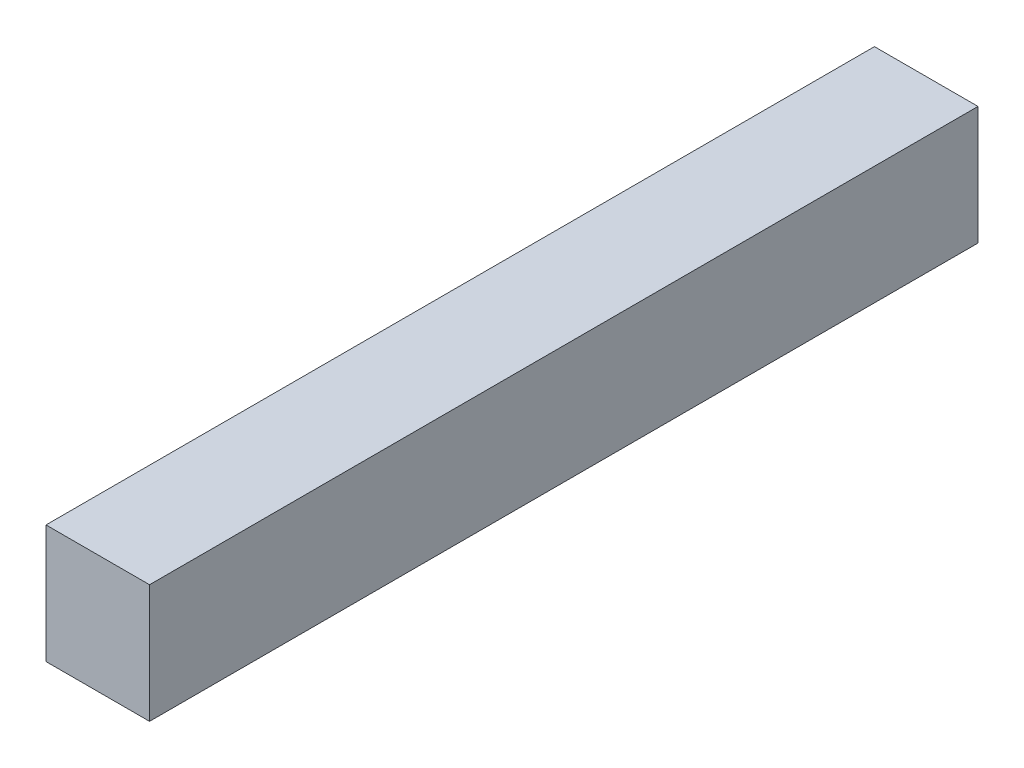
ISO-10303-21;
HEADER;
FILE_DESCRIPTION(('STEP AP214'),'2;1');
FILE_NAME('part.step','',(''),(''),'','','');
FILE_SCHEMA(('AUTOMOTIVE_DESIGN { 1 0 10303 214 1 1 1 1 }'));
ENDSEC;
DATA;
#1=APPLICATION_CONTEXT('core data for automotive mechanical design processes');
#2=APPLICATION_PROTOCOL_DEFINITION('international standard','automotive_design',2000,#1);
#3=PRODUCT_CONTEXT('',#1,'mechanical');
#4=PRODUCT('Part','Part','',(#3));
#5=PRODUCT_RELATED_PRODUCT_CATEGORY('part','',(#4));
#6=PRODUCT_DEFINITION_FORMATION('','',#4);
#7=PRODUCT_DEFINITION_CONTEXT('part definition',#1,'design');
#8=PRODUCT_DEFINITION('design','',#6,#7);
#9=PRODUCT_DEFINITION_SHAPE('','',#8);
#10=(LENGTH_UNIT() NAMED_UNIT(*) SI_UNIT(.MILLI.,.METRE.));
#11=(NAMED_UNIT(*) PLANE_ANGLE_UNIT() SI_UNIT($,.RADIAN.));
#12=(NAMED_UNIT(*) SI_UNIT($,.STERADIAN.) SOLID_ANGLE_UNIT());
#13=UNCERTAINTY_MEASURE_WITH_UNIT(LENGTH_MEASURE(1.E-05),#10,'distance_accuracy_value','');
#14=(GEOMETRIC_REPRESENTATION_CONTEXT(3) GLOBAL_UNCERTAINTY_ASSIGNED_CONTEXT((#13)) GLOBAL_UNIT_ASSIGNED_CONTEXT((#10,
#11,#12)) REPRESENTATION_CONTEXT('',''));
#15=CARTESIAN_POINT('',(0.,0.,0.));
#16=DIRECTION('',(0.,0.,1.));
#17=DIRECTION('',(1.,0.,0.));
#18=AXIS2_PLACEMENT_3D('',#15,#16,#17);
#19=CARTESIAN_POINT('',(11.,-4.,28.));
#20=DIRECTION('',(0.,0.,1.));
#21=DIRECTION('',(1.,0.,0.));
#22=AXIS2_PLACEMENT_3D('',#19,#20,#21);
#23=PLANE('',#22);
#24=DIRECTION('',(0.,1.,0.));
#25=VECTOR('',#24,1.);
#26=CARTESIAN_POINT('',(11.,-4.,28.));
#27=LINE('',#26,#25);
#28=CARTESIAN_POINT('',(11.,-4.,28.));
#29=VERTEX_POINT('',#28);
#30=CARTESIAN_POINT('',(11.,4.,28.));
#31=VERTEX_POINT('',#30);
#32=EDGE_CURVE('E66',#29,#31,#27,.T.);
#33=ORIENTED_EDGE('',*,*,#32,.F.);
#34=DIRECTION('',(1.,0.,0.));
#35=VECTOR('',#34,1.);
#36=CARTESIAN_POINT('',(11.,-4.,28.));
#37=LINE('',#36,#35);
#38=CARTESIAN_POINT('',(18.,-4.,28.));
#39=VERTEX_POINT('',#38);
#40=EDGE_CURVE('E61',#29,#39,#37,.T.);
#41=ORIENTED_EDGE('',*,*,#40,.T.);
#42=DIRECTION('',(0.,1.,0.));
#43=VECTOR('',#42,1.);
#44=CARTESIAN_POINT('',(18.,-4.,28.));
#45=LINE('',#44,#43);
#46=CARTESIAN_POINT('',(18.,4.,28.));
#47=VERTEX_POINT('',#46);
#48=EDGE_CURVE('E64',#39,#47,#45,.T.);
#49=ORIENTED_EDGE('',*,*,#48,.T.);
#50=DIRECTION('',(1.,0.,0.));
#51=VECTOR('',#50,1.);
#52=CARTESIAN_POINT('',(11.,4.,28.));
#53=LINE('',#52,#51);
#54=EDGE_CURVE('E9',#31,#47,#53,.T.);
#55=ORIENTED_EDGE('',*,*,#54,.F.);
#56=EDGE_LOOP('',(#33,#41,#49,#55));
#57=FACE_BOUND('',#56,.T.);
#58=ADVANCED_FACE('F15',(#57),#23,.T.);
#59=CARTESIAN_POINT('',(11.,-4.,-28.));
#60=DIRECTION('',(0.,0.,1.));
#61=DIRECTION('',(1.,0.,0.));
#62=AXIS2_PLACEMENT_3D('',#59,#60,#61);
#63=PLANE('',#62);
#64=DIRECTION('',(1.,0.,0.));
#65=VECTOR('',#64,1.);
#66=CARTESIAN_POINT('',(11.,4.,-28.));
#67=LINE('',#66,#65);
#68=CARTESIAN_POINT('',(11.,4.,-28.));
#69=VERTEX_POINT('',#68);
#70=CARTESIAN_POINT('',(18.,4.,-28.));
#71=VERTEX_POINT('',#70);
#72=EDGE_CURVE('E24',#69,#71,#67,.T.);
#73=ORIENTED_EDGE('',*,*,#72,.T.);
#74=DIRECTION('',(0.,1.,0.));
#75=VECTOR('',#74,1.);
#76=CARTESIAN_POINT('',(18.,-4.,-28.));
#77=LINE('',#76,#75);
#78=CARTESIAN_POINT('',(18.,-4.,-28.));
#79=VERTEX_POINT('',#78);
#80=EDGE_CURVE('E84',#79,#71,#77,.T.);
#81=ORIENTED_EDGE('',*,*,#80,.F.);
#82=DIRECTION('',(1.,0.,0.));
#83=VECTOR('',#82,1.);
#84=CARTESIAN_POINT('',(11.,-4.,-28.));
#85=LINE('',#84,#83);
#86=CARTESIAN_POINT('',(11.,-4.,-28.));
#87=VERTEX_POINT('',#86);
#88=EDGE_CURVE('E71',#87,#79,#85,.T.);
#89=ORIENTED_EDGE('',*,*,#88,.F.);
#90=DIRECTION('',(0.,1.,0.));
#91=VECTOR('',#90,1.);
#92=CARTESIAN_POINT('',(11.,-4.,-28.));
#93=LINE('',#92,#91);
#94=EDGE_CURVE('E94',#87,#69,#93,.T.);
#95=ORIENTED_EDGE('',*,*,#94,.T.);
#96=EDGE_LOOP('',(#73,#81,#89,#95));
#97=FACE_BOUND('',#96,.T.);
#98=ADVANCED_FACE('F117',(#97),#63,.F.);
#99=CARTESIAN_POINT('',(11.,4.,-28.));
#100=DIRECTION('',(0.,1.,0.));
#101=DIRECTION('',(1.,0.,0.));
#102=AXIS2_PLACEMENT_3D('',#99,#100,#101);
#103=PLANE('',#102);
#104=ORIENTED_EDGE('',*,*,#72,.F.);
#105=DIRECTION('',(0.,0.,1.));
#106=VECTOR('',#105,1.);
#107=CARTESIAN_POINT('',(11.,4.,-28.));
#108=LINE('',#107,#106);
#109=EDGE_CURVE('E98',#69,#31,#108,.T.);
#110=ORIENTED_EDGE('',*,*,#109,.T.);
#111=ORIENTED_EDGE('',*,*,#54,.T.);
#112=DIRECTION('',(0.,0.,1.));
#113=VECTOR('',#112,1.);
#114=CARTESIAN_POINT('',(18.,4.,-28.));
#115=LINE('',#114,#113);
#116=EDGE_CURVE('E78',#71,#47,#115,.T.);
#117=ORIENTED_EDGE('',*,*,#116,.F.);
#118=EDGE_LOOP('',(#104,#110,#111,#117));
#119=FACE_BOUND('',#118,.T.);
#120=ADVANCED_FACE('F111',(#119),#103,.T.);
#121=CARTESIAN_POINT('',(11.,-4.,-28.));
#122=DIRECTION('',(0.,1.,0.));
#123=DIRECTION('',(1.,0.,0.));
#124=AXIS2_PLACEMENT_3D('',#121,#122,#123);
#125=PLANE('',#124);
#126=DIRECTION('',(0.,0.,1.));
#127=VECTOR('',#126,1.);
#128=CARTESIAN_POINT('',(18.,-4.,-28.));
#129=LINE('',#128,#127);
#130=EDGE_CURVE('E77',#79,#39,#129,.T.);
#131=ORIENTED_EDGE('',*,*,#130,.T.);
#132=ORIENTED_EDGE('',*,*,#40,.F.);
#133=DIRECTION('',(0.,0.,1.));
#134=VECTOR('',#133,1.);
#135=CARTESIAN_POINT('',(11.,-4.,-28.));
#136=LINE('',#135,#134);
#137=EDGE_CURVE('E88',#87,#29,#136,.T.);
#138=ORIENTED_EDGE('',*,*,#137,.F.);
#139=ORIENTED_EDGE('',*,*,#88,.T.);
#140=EDGE_LOOP('',(#131,#132,#138,#139));
#141=FACE_BOUND('',#140,.T.);
#142=ADVANCED_FACE('F85',(#141),#125,.F.);
#143=CARTESIAN_POINT('',(18.,-4.,-28.));
#144=DIRECTION('',(1.,0.,0.));
#145=DIRECTION('',(0.,1.,0.));
#146=AXIS2_PLACEMENT_3D('',#143,#144,#145);
#147=PLANE('',#146);
#148=ORIENTED_EDGE('',*,*,#130,.F.);
#149=ORIENTED_EDGE('',*,*,#80,.T.);
#150=ORIENTED_EDGE('',*,*,#116,.T.);
#151=ORIENTED_EDGE('',*,*,#48,.F.);
#152=EDGE_LOOP('',(#148,#149,#150,#151));
#153=FACE_BOUND('',#152,.T.);
#154=ADVANCED_FACE('F76',(#153),#147,.T.);
#155=CARTESIAN_POINT('',(11.,-4.,-28.));
#156=DIRECTION('',(1.,0.,0.));
#157=DIRECTION('',(0.,1.,0.));
#158=AXIS2_PLACEMENT_3D('',#155,#156,#157);
#159=PLANE('',#158);
#160=ORIENTED_EDGE('',*,*,#32,.T.);
#161=ORIENTED_EDGE('',*,*,#109,.F.);
#162=ORIENTED_EDGE('',*,*,#94,.F.);
#163=ORIENTED_EDGE('',*,*,#137,.T.);
#164=EDGE_LOOP('',(#160,#161,#162,#163));
#165=FACE_BOUND('',#164,.T.);
#166=ADVANCED_FACE('F116',(#165),#159,.F.);
#167=CLOSED_SHELL('',(#58,#98,#120,#142,#154,#166));
#168=MANIFOLD_SOLID_BREP('B1',#167);
#169=ADVANCED_BREP_SHAPE_REPRESENTATION('',(#18,#168),#14);
#170=SHAPE_DEFINITION_REPRESENTATION(#9,#169);
ENDSEC;
END-ISO-10303-21;
